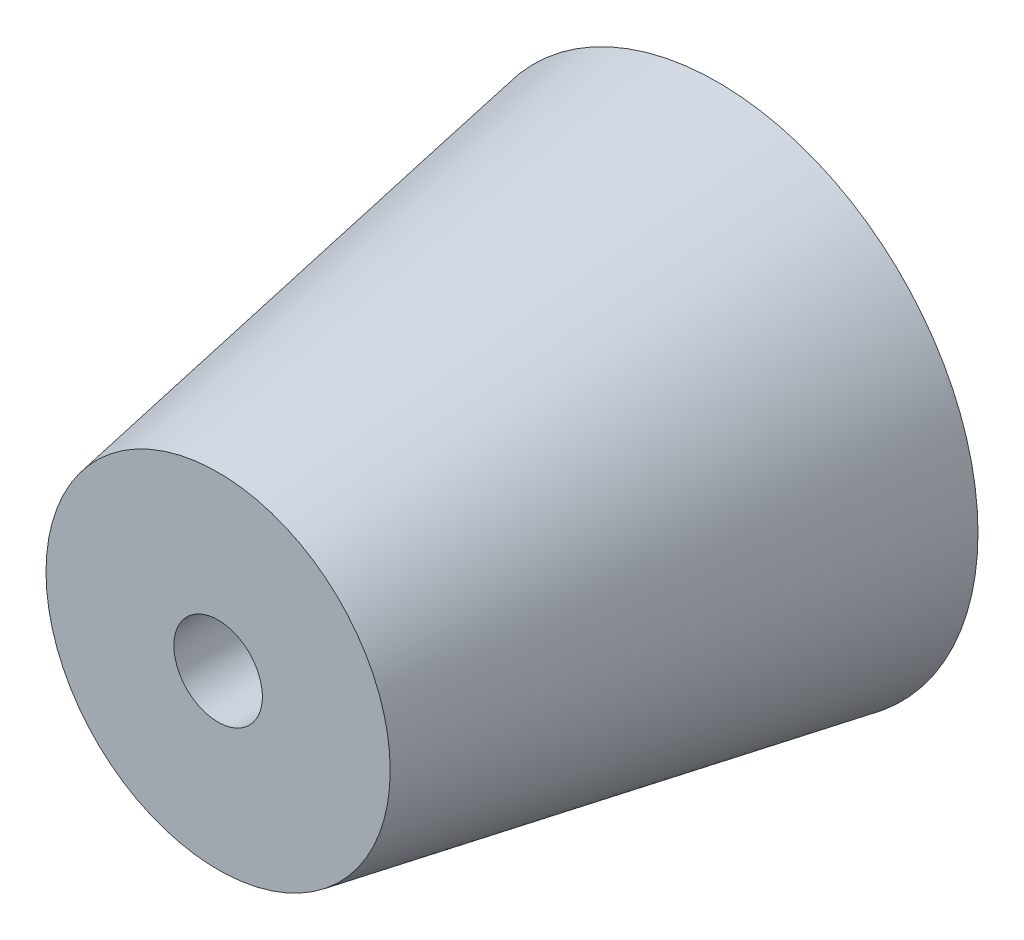
ISO-10303-21;
HEADER;
FILE_DESCRIPTION(('STEP AP214'),'2;1');
FILE_NAME('part.step','',(''),(''),'','','');
FILE_SCHEMA(('AUTOMOTIVE_DESIGN { 1 0 10303 214 1 1 1 1 }'));
ENDSEC;
DATA;
#1=APPLICATION_CONTEXT('core data for automotive mechanical design processes');
#2=APPLICATION_PROTOCOL_DEFINITION('international standard','automotive_design',2000,#1);
#3=PRODUCT_CONTEXT('',#1,'mechanical');
#4=PRODUCT('Part','Part','',(#3));
#5=PRODUCT_RELATED_PRODUCT_CATEGORY('part','',(#4));
#6=PRODUCT_DEFINITION_FORMATION('','',#4);
#7=PRODUCT_DEFINITION_CONTEXT('part definition',#1,'design');
#8=PRODUCT_DEFINITION('design','',#6,#7);
#9=PRODUCT_DEFINITION_SHAPE('','',#8);
#10=(LENGTH_UNIT() NAMED_UNIT(*) SI_UNIT(.MILLI.,.METRE.));
#11=(NAMED_UNIT(*) PLANE_ANGLE_UNIT() SI_UNIT($,.RADIAN.));
#12=(NAMED_UNIT(*) SI_UNIT($,.STERADIAN.) SOLID_ANGLE_UNIT());
#13=UNCERTAINTY_MEASURE_WITH_UNIT(LENGTH_MEASURE(1.E-05),#10,'distance_accuracy_value','');
#14=(GEOMETRIC_REPRESENTATION_CONTEXT(3) GLOBAL_UNCERTAINTY_ASSIGNED_CONTEXT((#13)) GLOBAL_UNIT_ASSIGNED_CONTEXT((#10,
#11,#12)) REPRESENTATION_CONTEXT('',''));
#15=CARTESIAN_POINT('',(0.,0.,0.));
#16=DIRECTION('',(0.,0.,1.));
#17=DIRECTION('',(1.,0.,0.));
#18=AXIS2_PLACEMENT_3D('',#15,#16,#17);
#19=CARTESIAN_POINT('',(0.,0.,50.8));
#20=DIRECTION('',(0.,0.,-1.));
#21=DIRECTION('',(-1.,0.,0.));
#22=AXIS2_PLACEMENT_3D('',#19,#20,#21);
#23=CYLINDRICAL_SURFACE('',#22,4.5);
#24=CARTESIAN_POINT('',(0.,0.,50.8));
#25=DIRECTION('',(0.,0.,-1.));
#26=DIRECTION('',(-1.,0.,0.));
#27=AXIS2_PLACEMENT_3D('',#24,#25,#26);
#28=CIRCLE('',#27,4.5);
#29=CARTESIAN_POINT('',(-4.5,0.,50.8));
#30=VERTEX_POINT('',#29);
#31=EDGE_CURVE('E43',#30,#30,#28,.T.);
#32=ORIENTED_EDGE('',*,*,#31,.F.);
#33=EDGE_LOOP('',(#32));
#34=FACE_BOUND('',#33,.T.);
#35=CARTESIAN_POINT('',(0.,0.,7.99));
#36=DIRECTION('',(0.,0.,-1.));
#37=DIRECTION('',(-1.,0.,0.));
#38=AXIS2_PLACEMENT_3D('',#35,#36,#37);
#39=CIRCLE('',#38,4.5);
#40=CARTESIAN_POINT('',(-4.5,0.,7.99));
#41=VERTEX_POINT('',#40);
#42=EDGE_CURVE('E35',#41,#41,#39,.F.);
#43=ORIENTED_EDGE('',*,*,#42,.F.);
#44=EDGE_LOOP('',(#43));
#45=FACE_BOUND('',#44,.T.);
#46=ADVANCED_FACE('F31',(#34,#45),#23,.F.);
#47=CARTESIAN_POINT('',(0.,0.,50.8));
#48=DIRECTION('',(0.,0.,-1.));
#49=DIRECTION('',(1.,0.,0.));
#50=AXIS2_PLACEMENT_3D('',#47,#48,#49);
#51=CONICAL_SURFACE('',#50,17.5,0.174532925199433);
#52=CARTESIAN_POINT('',(0.,0.,-0.0100000000000031));
#53=DIRECTION('',(0.,0.,1.));
#54=DIRECTION('',(1.,0.,0.));
#55=AXIS2_PLACEMENT_3D('',#52,#53,#54);
#56=CIRCLE('',#55,26.4591738897971);
#57=CARTESIAN_POINT('',(26.4591738897971,0.,-0.0100000000000031));
#58=VERTEX_POINT('',#57);
#59=EDGE_CURVE('E10',#58,#58,#56,.T.);
#60=ORIENTED_EDGE('',*,*,#59,.T.);
#61=EDGE_LOOP('',(#60));
#62=FACE_BOUND('',#61,.T.);
#63=CARTESIAN_POINT('',(0.,0.,50.8));
#64=DIRECTION('',(0.,0.,1.));
#65=DIRECTION('',(1.,0.,0.));
#66=AXIS2_PLACEMENT_3D('',#63,#64,#65);
#67=CIRCLE('',#66,17.5);
#68=CARTESIAN_POINT('',(17.5,0.,50.8));
#69=VERTEX_POINT('',#68);
#70=EDGE_CURVE('E39',#69,#69,#67,.T.);
#71=ORIENTED_EDGE('',*,*,#70,.F.);
#72=EDGE_LOOP('',(#71));
#73=FACE_BOUND('',#72,.T.);
#74=ADVANCED_FACE('F33',(#62,#73),#51,.T.);
#75=CARTESIAN_POINT('',(0.,0.,-0.01));
#76=DIRECTION('',(0.,0.,1.));
#77=DIRECTION('',(1.,0.,0.));
#78=AXIS2_PLACEMENT_3D('',#75,#76,#77);
#79=PLANE('',#78);
#80=CARTESIAN_POINT('',(0.,0.,-0.01));
#81=DIRECTION('',(0.,0.,-1.));
#82=DIRECTION('',(-1.,0.,0.));
#83=AXIS2_PLACEMENT_3D('',#80,#81,#82);
#84=CIRCLE('',#83,11.5);
#85=CARTESIAN_POINT('',(-11.5,0.,-0.01));
#86=VERTEX_POINT('',#85);
#87=EDGE_CURVE('E48',#86,#86,#84,.T.);
#88=ORIENTED_EDGE('',*,*,#87,.F.);
#89=EDGE_LOOP('',(#88));
#90=FACE_BOUND('',#89,.T.);
#91=ORIENTED_EDGE('',*,*,#59,.F.);
#92=EDGE_LOOP('',(#91));
#93=FACE_BOUND('',#92,.T.);
#94=ADVANCED_FACE('F66',(#90,#93),#79,.F.);
#95=CARTESIAN_POINT('',(0.,0.,50.8));
#96=DIRECTION('',(0.,0.,1.));
#97=DIRECTION('',(1.,0.,0.));
#98=AXIS2_PLACEMENT_3D('',#95,#96,#97);
#99=PLANE('',#98);
#100=ORIENTED_EDGE('',*,*,#31,.T.);
#101=EDGE_LOOP('',(#100));
#102=FACE_BOUND('',#101,.T.);
#103=ORIENTED_EDGE('',*,*,#70,.T.);
#104=EDGE_LOOP('',(#103));
#105=FACE_BOUND('',#104,.T.);
#106=ADVANCED_FACE('F72',(#102,#105),#99,.T.);
#107=CARTESIAN_POINT('',(0.,0.,7.99));
#108=DIRECTION('',(0.,0.,-1.));
#109=DIRECTION('',(-1.,0.,0.));
#110=AXIS2_PLACEMENT_3D('',#107,#108,#109);
#111=PLANE('',#110);
#112=CARTESIAN_POINT('',(0.,0.,7.99));
#113=DIRECTION('',(0.,0.,-1.));
#114=DIRECTION('',(-1.,0.,0.));
#115=AXIS2_PLACEMENT_3D('',#112,#113,#114);
#116=CIRCLE('',#115,11.5);
#117=CARTESIAN_POINT('',(-11.5,0.,7.99));
#118=VERTEX_POINT('',#117);
#119=EDGE_CURVE('E51',#118,#118,#116,.T.);
#120=ORIENTED_EDGE('',*,*,#119,.T.);
#121=EDGE_LOOP('',(#120));
#122=FACE_BOUND('',#121,.T.);
#123=ORIENTED_EDGE('',*,*,#42,.T.);
#124=EDGE_LOOP('',(#123));
#125=FACE_BOUND('',#124,.T.);
#126=ADVANCED_FACE('F58',(#122,#125),#111,.T.);
#127=CARTESIAN_POINT('',(0.,0.,7.99));
#128=DIRECTION('',(0.,0.,-1.));
#129=DIRECTION('',(-1.,0.,0.));
#130=AXIS2_PLACEMENT_3D('',#127,#128,#129);
#131=CYLINDRICAL_SURFACE('',#130,11.5);
#132=ORIENTED_EDGE('',*,*,#119,.F.);
#133=EDGE_LOOP('',(#132));
#134=FACE_BOUND('',#133,.T.);
#135=ORIENTED_EDGE('',*,*,#87,.T.);
#136=EDGE_LOOP('',(#135));
#137=FACE_BOUND('',#136,.T.);
#138=ADVANCED_FACE('F70',(#134,#137),#131,.F.);
#139=CLOSED_SHELL('',(#46,#74,#94,#106,#126,#138));
#140=MANIFOLD_SOLID_BREP('B2',#139);
#141=ADVANCED_BREP_SHAPE_REPRESENTATION('',(#18,#140),#14);
#142=SHAPE_DEFINITION_REPRESENTATION(#9,#141);
ENDSEC;
END-ISO-10303-21;
